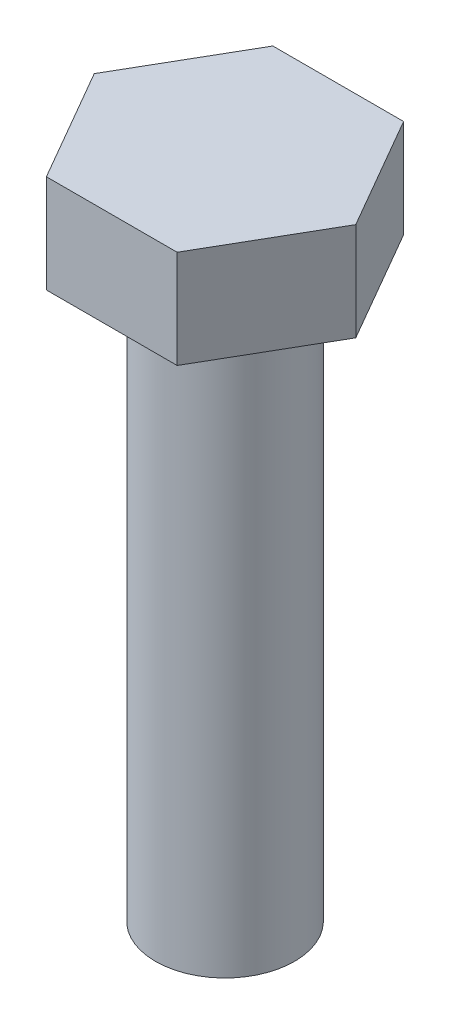
ISO-10303-21;
HEADER;
FILE_DESCRIPTION(('STEP AP214'),'2;1');
FILE_NAME('part.step','',(''),(''),'','','');
FILE_SCHEMA(('AUTOMOTIVE_DESIGN { 1 0 10303 214 1 1 1 1 }'));
ENDSEC;
DATA;
#1=APPLICATION_CONTEXT('core data for automotive mechanical design processes');
#2=APPLICATION_PROTOCOL_DEFINITION('international standard','automotive_design',2000,#1);
#3=PRODUCT_CONTEXT('',#1,'mechanical');
#4=PRODUCT('Part','Part','',(#3));
#5=PRODUCT_RELATED_PRODUCT_CATEGORY('part','',(#4));
#6=PRODUCT_DEFINITION_FORMATION('','',#4);
#7=PRODUCT_DEFINITION_CONTEXT('part definition',#1,'design');
#8=PRODUCT_DEFINITION('design','',#6,#7);
#9=PRODUCT_DEFINITION_SHAPE('','',#8);
#10=(LENGTH_UNIT() NAMED_UNIT(*) SI_UNIT(.MILLI.,.METRE.));
#11=(NAMED_UNIT(*) PLANE_ANGLE_UNIT() SI_UNIT($,.RADIAN.));
#12=(NAMED_UNIT(*) SI_UNIT($,.STERADIAN.) SOLID_ANGLE_UNIT());
#13=UNCERTAINTY_MEASURE_WITH_UNIT(LENGTH_MEASURE(1.E-05),#10,'distance_accuracy_value','');
#14=(GEOMETRIC_REPRESENTATION_CONTEXT(3) GLOBAL_UNCERTAINTY_ASSIGNED_CONTEXT((#13)) GLOBAL_UNIT_ASSIGNED_CONTEXT((#10,
#11,#12)) REPRESENTATION_CONTEXT('',''));
#15=CARTESIAN_POINT('',(0.,0.,0.));
#16=DIRECTION('',(0.,0.,1.));
#17=DIRECTION('',(1.,0.,0.));
#18=AXIS2_PLACEMENT_3D('',#15,#16,#17);
#19=CARTESIAN_POINT('',(3.66617420935412,5.5,6.35));
#20=DIRECTION('',(-0.866025403784439,0.,-0.5));
#21=DIRECTION('',(-0.5,0.,0.866025403784439));
#22=AXIS2_PLACEMENT_3D('',#19,#20,#21);
#23=PLANE('',#22);
#24=DIRECTION('',(0.5,0.,-0.866025403784439));
#25=VECTOR('',#24,1.);
#26=CARTESIAN_POINT('',(3.66617420935412,0.,6.35));
#27=LINE('',#26,#25);
#28=CARTESIAN_POINT('',(3.66617420935412,0.,6.35));
#29=VERTEX_POINT('',#28);
#30=CARTESIAN_POINT('',(7.33234841870825,0.,0.));
#31=VERTEX_POINT('',#30);
#32=EDGE_CURVE('E123',#29,#31,#27,.T.);
#33=ORIENTED_EDGE('',*,*,#32,.T.);
#34=DIRECTION('',(0.,-1.,0.));
#35=VECTOR('',#34,1.);
#36=CARTESIAN_POINT('',(7.33234841870825,5.5,0.));
#37=LINE('',#36,#35);
#38=CARTESIAN_POINT('',(7.33234841870825,5.5,0.));
#39=VERTEX_POINT('',#38);
#40=EDGE_CURVE('E11',#39,#31,#37,.T.);
#41=ORIENTED_EDGE('',*,*,#40,.F.);
#42=DIRECTION('',(0.5,0.,-0.866025403784439));
#43=VECTOR('',#42,1.);
#44=CARTESIAN_POINT('',(3.66617420935412,5.5,6.35));
#45=LINE('',#44,#43);
#46=CARTESIAN_POINT('',(3.66617420935412,5.5,6.35));
#47=VERTEX_POINT('',#46);
#48=EDGE_CURVE('E135',#47,#39,#45,.T.);
#49=ORIENTED_EDGE('',*,*,#48,.F.);
#50=DIRECTION('',(0.,-1.,0.));
#51=VECTOR('',#50,1.);
#52=CARTESIAN_POINT('',(3.66617420935412,5.5,6.35));
#53=LINE('',#52,#51);
#54=EDGE_CURVE('E120',#47,#29,#53,.T.);
#55=ORIENTED_EDGE('',*,*,#54,.T.);
#56=EDGE_LOOP('',(#33,#41,#49,#55));
#57=FACE_BOUND('',#56,.T.);
#58=ADVANCED_FACE('F39',(#57),#23,.F.);
#59=CARTESIAN_POINT('',(7.33234841870825,5.5,0.));
#60=DIRECTION('',(-0.866025403784439,0.,0.5));
#61=DIRECTION('',(0.5,0.,0.866025403784439));
#62=AXIS2_PLACEMENT_3D('',#59,#60,#61);
#63=PLANE('',#62);
#64=DIRECTION('',(-0.5,0.,-0.866025403784439));
#65=VECTOR('',#64,1.);
#66=CARTESIAN_POINT('',(7.33234841870825,0.,0.));
#67=LINE('',#66,#65);
#68=CARTESIAN_POINT('',(3.66617420935412,0.,-6.35));
#69=VERTEX_POINT('',#68);
#70=EDGE_CURVE('E127',#31,#69,#67,.T.);
#71=ORIENTED_EDGE('',*,*,#70,.T.);
#72=DIRECTION('',(0.,-1.,0.));
#73=VECTOR('',#72,1.);
#74=CARTESIAN_POINT('',(3.66617420935412,5.5,-6.35));
#75=LINE('',#74,#73);
#76=CARTESIAN_POINT('',(3.66617420935412,5.5,-6.35));
#77=VERTEX_POINT('',#76);
#78=EDGE_CURVE('E50',#77,#69,#75,.T.);
#79=ORIENTED_EDGE('',*,*,#78,.F.);
#80=DIRECTION('',(-0.5,0.,-0.866025403784439));
#81=VECTOR('',#80,1.);
#82=CARTESIAN_POINT('',(7.33234841870825,5.5,0.));
#83=LINE('',#82,#81);
#84=EDGE_CURVE('E95',#39,#77,#83,.T.);
#85=ORIENTED_EDGE('',*,*,#84,.F.);
#86=ORIENTED_EDGE('',*,*,#40,.T.);
#87=EDGE_LOOP('',(#71,#79,#85,#86));
#88=FACE_BOUND('',#87,.T.);
#89=ADVANCED_FACE('F158',(#88),#63,.F.);
#90=CARTESIAN_POINT('',(3.66617420935412,5.5,-6.35));
#91=DIRECTION('',(0.,0.,1.));
#92=DIRECTION('',(1.,0.,0.));
#93=AXIS2_PLACEMENT_3D('',#90,#91,#92);
#94=PLANE('',#93);
#95=DIRECTION('',(-1.,0.,0.));
#96=VECTOR('',#95,1.);
#97=CARTESIAN_POINT('',(3.66617420935412,0.,-6.35));
#98=LINE('',#97,#96);
#99=CARTESIAN_POINT('',(-3.66617420935412,0.,-6.35));
#100=VERTEX_POINT('',#99);
#101=EDGE_CURVE('E129',#69,#100,#98,.T.);
#102=ORIENTED_EDGE('',*,*,#101,.T.);
#103=DIRECTION('',(0.,-1.,0.));
#104=VECTOR('',#103,1.);
#105=CARTESIAN_POINT('',(-3.66617420935412,5.5,-6.35));
#106=LINE('',#105,#104);
#107=CARTESIAN_POINT('',(-3.66617420935412,5.5,-6.35));
#108=VERTEX_POINT('',#107);
#109=EDGE_CURVE('E111',#108,#100,#106,.T.);
#110=ORIENTED_EDGE('',*,*,#109,.F.);
#111=DIRECTION('',(-1.,0.,0.));
#112=VECTOR('',#111,1.);
#113=CARTESIAN_POINT('',(3.66617420935412,5.5,-6.35));
#114=LINE('',#113,#112);
#115=EDGE_CURVE('E104',#77,#108,#114,.T.);
#116=ORIENTED_EDGE('',*,*,#115,.F.);
#117=ORIENTED_EDGE('',*,*,#78,.T.);
#118=EDGE_LOOP('',(#102,#110,#116,#117));
#119=FACE_BOUND('',#118,.T.);
#120=ADVANCED_FACE('F139',(#119),#94,.F.);
#121=CARTESIAN_POINT('',(-3.66617420935412,5.5,-6.35));
#122=DIRECTION('',(0.866025403784439,0.,0.5));
#123=DIRECTION('',(0.5,0.,-0.866025403784439));
#124=AXIS2_PLACEMENT_3D('',#121,#122,#123);
#125=PLANE('',#124);
#126=DIRECTION('',(-0.5,0.,0.866025403784439));
#127=VECTOR('',#126,1.);
#128=CARTESIAN_POINT('',(-3.66617420935412,0.,-6.35));
#129=LINE('',#128,#127);
#130=CARTESIAN_POINT('',(-7.33234841870825,0.,0.));
#131=VERTEX_POINT('',#130);
#132=EDGE_CURVE('E114',#100,#131,#129,.T.);
#133=ORIENTED_EDGE('',*,*,#132,.T.);
#134=DIRECTION('',(0.,-1.,0.));
#135=VECTOR('',#134,1.);
#136=CARTESIAN_POINT('',(-7.33234841870825,5.5,0.));
#137=LINE('',#136,#135);
#138=CARTESIAN_POINT('',(-7.33234841870825,5.5,0.));
#139=VERTEX_POINT('',#138);
#140=EDGE_CURVE('E109',#139,#131,#137,.T.);
#141=ORIENTED_EDGE('',*,*,#140,.F.);
#142=DIRECTION('',(-0.5,0.,0.866025403784439));
#143=VECTOR('',#142,1.);
#144=CARTESIAN_POINT('',(-3.66617420935412,5.5,-6.35));
#145=LINE('',#144,#143);
#146=EDGE_CURVE('E97',#108,#139,#145,.T.);
#147=ORIENTED_EDGE('',*,*,#146,.F.);
#148=ORIENTED_EDGE('',*,*,#109,.T.);
#149=EDGE_LOOP('',(#133,#141,#147,#148));
#150=FACE_BOUND('',#149,.T.);
#151=ADVANCED_FACE('F112',(#150),#125,.F.);
#152=CARTESIAN_POINT('',(-7.33234841870825,5.5,0.));
#153=DIRECTION('',(0.866025403784439,0.,-0.5));
#154=DIRECTION('',(-0.5,0.,-0.866025403784439));
#155=AXIS2_PLACEMENT_3D('',#152,#153,#154);
#156=PLANE('',#155);
#157=DIRECTION('',(0.5,0.,0.866025403784439));
#158=VECTOR('',#157,1.);
#159=CARTESIAN_POINT('',(-7.33234841870825,0.,0.));
#160=LINE('',#159,#158);
#161=CARTESIAN_POINT('',(-3.66617420935412,0.,6.35));
#162=VERTEX_POINT('',#161);
#163=EDGE_CURVE('E77',#131,#162,#160,.T.);
#164=ORIENTED_EDGE('',*,*,#163,.T.);
#165=DIRECTION('',(0.,-1.,0.));
#166=VECTOR('',#165,1.);
#167=CARTESIAN_POINT('',(-3.66617420935412,5.5,6.35));
#168=LINE('',#167,#166);
#169=CARTESIAN_POINT('',(-3.66617420935412,5.5,6.35));
#170=VERTEX_POINT('',#169);
#171=EDGE_CURVE('E113',#170,#162,#168,.T.);
#172=ORIENTED_EDGE('',*,*,#171,.F.);
#173=DIRECTION('',(0.5,0.,0.866025403784439));
#174=VECTOR('',#173,1.);
#175=CARTESIAN_POINT('',(-7.33234841870825,5.5,0.));
#176=LINE('',#175,#174);
#177=EDGE_CURVE('E103',#139,#170,#176,.T.);
#178=ORIENTED_EDGE('',*,*,#177,.F.);
#179=ORIENTED_EDGE('',*,*,#140,.T.);
#180=EDGE_LOOP('',(#164,#172,#178,#179));
#181=FACE_BOUND('',#180,.T.);
#182=ADVANCED_FACE('F119',(#181),#156,.F.);
#183=CARTESIAN_POINT('',(-3.66617420935412,5.5,6.35));
#184=DIRECTION('',(0.,0.,-1.));
#185=DIRECTION('',(-1.,0.,0.));
#186=AXIS2_PLACEMENT_3D('',#183,#184,#185);
#187=PLANE('',#186);
#188=DIRECTION('',(1.,0.,0.));
#189=VECTOR('',#188,1.);
#190=CARTESIAN_POINT('',(-3.66617420935412,0.,6.35));
#191=LINE('',#190,#189);
#192=EDGE_CURVE('E82',#162,#29,#191,.T.);
#193=ORIENTED_EDGE('',*,*,#192,.T.);
#194=ORIENTED_EDGE('',*,*,#54,.F.);
#195=DIRECTION('',(1.,0.,0.));
#196=VECTOR('',#195,1.);
#197=CARTESIAN_POINT('',(-3.66617420935412,5.5,6.35));
#198=LINE('',#197,#196);
#199=EDGE_CURVE('E54',#170,#47,#198,.T.);
#200=ORIENTED_EDGE('',*,*,#199,.F.);
#201=ORIENTED_EDGE('',*,*,#171,.T.);
#202=EDGE_LOOP('',(#193,#194,#200,#201));
#203=FACE_BOUND('',#202,.T.);
#204=ADVANCED_FACE('F150',(#203),#187,.F.);
#205=CARTESIAN_POINT('',(0.,5.5,0.));
#206=DIRECTION('',(0.,1.,0.));
#207=DIRECTION('',(0.,0.,1.));
#208=AXIS2_PLACEMENT_3D('',#205,#206,#207);
#209=PLANE('',#208);
#210=ORIENTED_EDGE('',*,*,#48,.T.);
#211=ORIENTED_EDGE('',*,*,#84,.T.);
#212=ORIENTED_EDGE('',*,*,#115,.T.);
#213=ORIENTED_EDGE('',*,*,#146,.T.);
#214=ORIENTED_EDGE('',*,*,#177,.T.);
#215=ORIENTED_EDGE('',*,*,#199,.T.);
#216=EDGE_LOOP('',(#210,#211,#212,#213,#214,#215));
#217=FACE_BOUND('',#216,.T.);
#218=ADVANCED_FACE('F101',(#217),#209,.T.);
#219=CARTESIAN_POINT('',(0.,0.,0.));
#220=DIRECTION('',(0.,1.,0.));
#221=DIRECTION('',(0.,0.,1.));
#222=AXIS2_PLACEMENT_3D('',#219,#220,#221);
#223=PLANE('',#222);
#224=CARTESIAN_POINT('',(0.,0.,0.));
#225=DIRECTION('',(0.,1.,0.));
#226=DIRECTION('',(0.,0.,1.));
#227=AXIS2_PLACEMENT_3D('',#224,#225,#226);
#228=CIRCLE('',#227,3.9);
#229=CARTESIAN_POINT('',(0.,0.,3.9));
#230=VERTEX_POINT('',#229);
#231=EDGE_CURVE('E130',#230,#230,#228,.T.);
#232=ORIENTED_EDGE('',*,*,#231,.T.);
#233=EDGE_LOOP('',(#232));
#234=FACE_BOUND('',#233,.T.);
#235=ORIENTED_EDGE('',*,*,#32,.F.);
#236=ORIENTED_EDGE('',*,*,#192,.F.);
#237=ORIENTED_EDGE('',*,*,#163,.F.);
#238=ORIENTED_EDGE('',*,*,#132,.F.);
#239=ORIENTED_EDGE('',*,*,#101,.F.);
#240=ORIENTED_EDGE('',*,*,#70,.F.);
#241=EDGE_LOOP('',(#235,#236,#237,#238,#239,#240));
#242=FACE_BOUND('',#241,.T.);
#243=ADVANCED_FACE('F141',(#234,#242),#223,.F.);
#244=CARTESIAN_POINT('',(0.,0.,0.));
#245=DIRECTION('',(0.,-1.,0.));
#246=DIRECTION('',(0.,0.,-1.));
#247=AXIS2_PLACEMENT_3D('',#244,#245,#246);
#248=CYLINDRICAL_SURFACE('',#247,3.9);
#249=ORIENTED_EDGE('',*,*,#231,.F.);
#250=EDGE_LOOP('',(#249));
#251=FACE_BOUND('',#250,.T.);
#252=CARTESIAN_POINT('',(0.,-32.,0.));
#253=DIRECTION('',(0.,1.,0.));
#254=DIRECTION('',(0.,0.,1.));
#255=AXIS2_PLACEMENT_3D('',#252,#253,#254);
#256=CIRCLE('',#255,3.9);
#257=CARTESIAN_POINT('',(0.,-32.,3.9));
#258=VERTEX_POINT('',#257);
#259=EDGE_CURVE('E222',#258,#258,#256,.T.);
#260=ORIENTED_EDGE('',*,*,#259,.T.);
#261=EDGE_LOOP('',(#260));
#262=FACE_BOUND('',#261,.T.);
#263=ADVANCED_FACE('F197',(#251,#262),#248,.T.);
#264=CARTESIAN_POINT('',(0.,-32.,0.));
#265=DIRECTION('',(0.,1.,0.));
#266=DIRECTION('',(0.,0.,1.));
#267=AXIS2_PLACEMENT_3D('',#264,#265,#266);
#268=PLANE('',#267);
#269=ORIENTED_EDGE('',*,*,#259,.F.);
#270=EDGE_LOOP('',(#269));
#271=FACE_BOUND('',#270,.T.);
#272=ADVANCED_FACE('F206',(#271),#268,.F.);
#273=CLOSED_SHELL('',(#58,#89,#120,#151,#182,#204,#218,#243,#263,#272));
#274=MANIFOLD_SOLID_BREP('B2',#273);
#275=ADVANCED_BREP_SHAPE_REPRESENTATION('',(#18,#274),#14);
#276=SHAPE_DEFINITION_REPRESENTATION(#9,#275);
ENDSEC;
END-ISO-10303-21;
